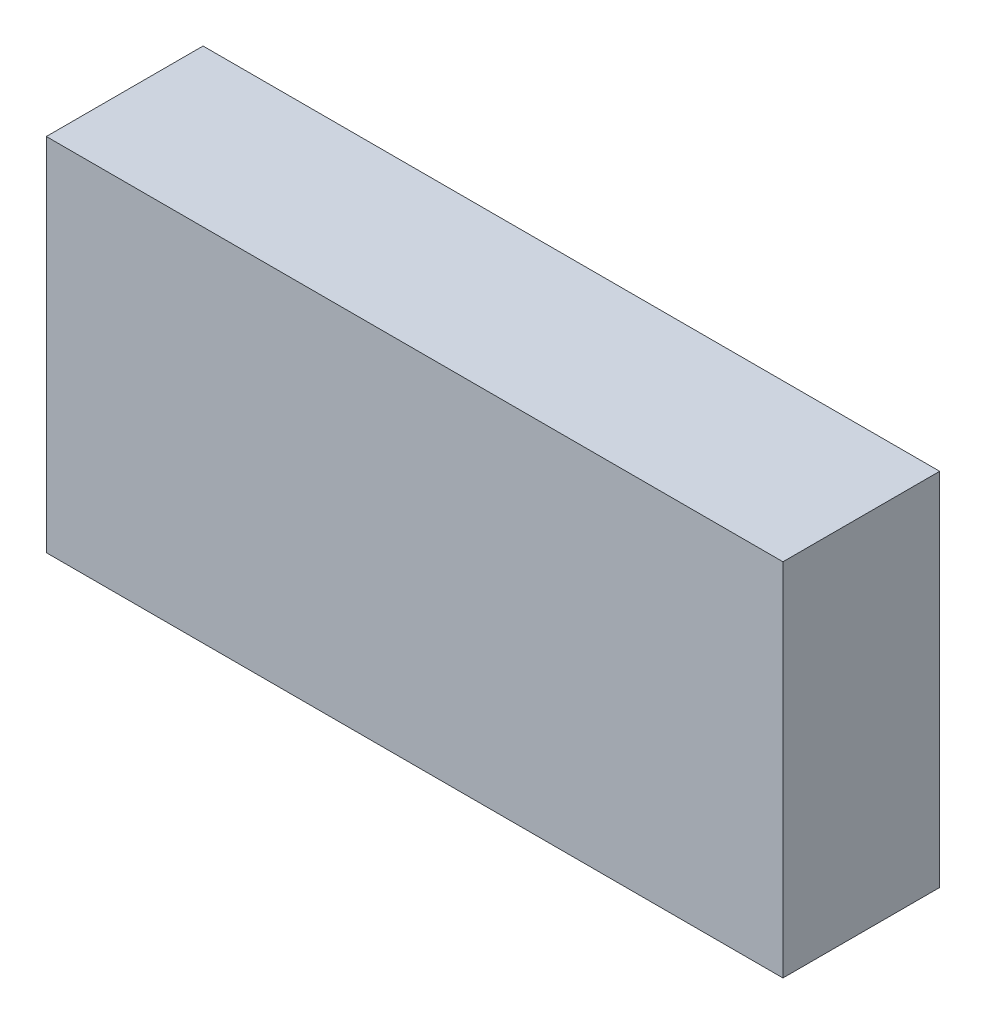
ISO-10303-21;
HEADER;
FILE_DESCRIPTION(('STEP AP214'),'2;1');
FILE_NAME('part.step','',(''),(''),'','','');
FILE_SCHEMA(('AUTOMOTIVE_DESIGN { 1 0 10303 214 1 1 1 1 }'));
ENDSEC;
DATA;
#1=APPLICATION_CONTEXT('core data for automotive mechanical design processes');
#2=APPLICATION_PROTOCOL_DEFINITION('international standard','automotive_design',2000,#1);
#3=PRODUCT_CONTEXT('',#1,'mechanical');
#4=PRODUCT('Part','Part','',(#3));
#5=PRODUCT_RELATED_PRODUCT_CATEGORY('part','',(#4));
#6=PRODUCT_DEFINITION_FORMATION('','',#4);
#7=PRODUCT_DEFINITION_CONTEXT('part definition',#1,'design');
#8=PRODUCT_DEFINITION('design','',#6,#7);
#9=PRODUCT_DEFINITION_SHAPE('','',#8);
#10=(LENGTH_UNIT() NAMED_UNIT(*) SI_UNIT(.MILLI.,.METRE.));
#11=(NAMED_UNIT(*) PLANE_ANGLE_UNIT() SI_UNIT($,.RADIAN.));
#12=(NAMED_UNIT(*) SI_UNIT($,.STERADIAN.) SOLID_ANGLE_UNIT());
#13=UNCERTAINTY_MEASURE_WITH_UNIT(LENGTH_MEASURE(1.E-05),#10,'distance_accuracy_value','');
#14=(GEOMETRIC_REPRESENTATION_CONTEXT(3) GLOBAL_UNCERTAINTY_ASSIGNED_CONTEXT((#13)) GLOBAL_UNIT_ASSIGNED_CONTEXT((#10,
#11,#12)) REPRESENTATION_CONTEXT('',''));
#15=CARTESIAN_POINT('',(0.,0.,0.));
#16=DIRECTION('',(0.,0.,1.));
#17=DIRECTION('',(1.,0.,0.));
#18=AXIS2_PLACEMENT_3D('',#15,#16,#17);
#19=CARTESIAN_POINT('',(-2.35,1.15,1.));
#20=DIRECTION('',(0.,0.,1.));
#21=DIRECTION('',(1.,0.,0.));
#22=AXIS2_PLACEMENT_3D('',#19,#20,#21);
#23=PLANE('',#22);
#24=DIRECTION('',(0.,1.,0.));
#25=VECTOR('',#24,1.);
#26=CARTESIAN_POINT('',(2.35,1.15,1.));
#27=LINE('',#26,#25);
#28=CARTESIAN_POINT('',(2.35,1.15,1.));
#29=VERTEX_POINT('',#28);
#30=CARTESIAN_POINT('',(2.35,-1.15,1.));
#31=VERTEX_POINT('',#30);
#32=EDGE_CURVE('E53',#29,#31,#27,.F.);
#33=ORIENTED_EDGE('',*,*,#32,.F.);
#34=DIRECTION('',(1.,0.,0.));
#35=VECTOR('',#34,1.);
#36=CARTESIAN_POINT('',(-2.35,1.15,1.));
#37=LINE('',#36,#35);
#38=CARTESIAN_POINT('',(-2.35,1.15,1.));
#39=VERTEX_POINT('',#38);
#40=EDGE_CURVE('E68',#39,#29,#37,.T.);
#41=ORIENTED_EDGE('',*,*,#40,.F.);
#42=DIRECTION('',(0.,1.,0.));
#43=VECTOR('',#42,1.);
#44=CARTESIAN_POINT('',(-2.35,-1.15,1.));
#45=LINE('',#44,#43);
#46=CARTESIAN_POINT('',(-2.35,-1.15,1.));
#47=VERTEX_POINT('',#46);
#48=EDGE_CURVE('E20',#47,#39,#45,.T.);
#49=ORIENTED_EDGE('',*,*,#48,.F.);
#50=DIRECTION('',(1.,0.,0.));
#51=VECTOR('',#50,1.);
#52=CARTESIAN_POINT('',(2.35,-1.15,1.));
#53=LINE('',#52,#51);
#54=EDGE_CURVE('E58',#31,#47,#53,.F.);
#55=ORIENTED_EDGE('',*,*,#54,.F.);
#56=EDGE_LOOP('',(#33,#41,#49,#55));
#57=FACE_BOUND('',#56,.T.);
#58=ADVANCED_FACE('F17',(#57),#23,.T.);
#59=CARTESIAN_POINT('',(-2.35,-1.15,0.));
#60=DIRECTION('',(-1.,0.,0.));
#61=DIRECTION('',(0.,0.,1.));
#62=AXIS2_PLACEMENT_3D('',#59,#60,#61);
#63=PLANE('',#62);
#64=DIRECTION('',(0.,0.,1.));
#65=VECTOR('',#64,1.);
#66=CARTESIAN_POINT('',(-2.35,1.15,0.));
#67=LINE('',#66,#65);
#68=CARTESIAN_POINT('',(-2.35,1.15,0.));
#69=VERTEX_POINT('',#68);
#70=EDGE_CURVE('E79',#69,#39,#67,.T.);
#71=ORIENTED_EDGE('',*,*,#70,.F.);
#72=DIRECTION('',(0.,1.,0.));
#73=VECTOR('',#72,1.);
#74=CARTESIAN_POINT('',(-2.35,1.15,0.));
#75=LINE('',#74,#73);
#76=CARTESIAN_POINT('',(-2.35,-1.15,0.));
#77=VERTEX_POINT('',#76);
#78=EDGE_CURVE('E74',#69,#77,#75,.F.);
#79=ORIENTED_EDGE('',*,*,#78,.T.);
#80=DIRECTION('',(0.,0.,-1.));
#81=VECTOR('',#80,1.);
#82=CARTESIAN_POINT('',(-2.35,-1.15,0.));
#83=LINE('',#82,#81);
#84=EDGE_CURVE('E63',#47,#77,#83,.T.);
#85=ORIENTED_EDGE('',*,*,#84,.F.);
#86=ORIENTED_EDGE('',*,*,#48,.T.);
#87=EDGE_LOOP('',(#71,#79,#85,#86));
#88=FACE_BOUND('',#87,.T.);
#89=ADVANCED_FACE('F73',(#88),#63,.T.);
#90=CARTESIAN_POINT('',(2.35,-1.15,0.));
#91=DIRECTION('',(0.,-1.,0.));
#92=DIRECTION('',(0.,0.,-1.));
#93=AXIS2_PLACEMENT_3D('',#90,#91,#92);
#94=PLANE('',#93);
#95=ORIENTED_EDGE('',*,*,#84,.T.);
#96=DIRECTION('',(1.,0.,0.));
#97=VECTOR('',#96,1.);
#98=CARTESIAN_POINT('',(-2.35,-1.15,0.));
#99=LINE('',#98,#97);
#100=CARTESIAN_POINT('',(2.35,-1.15,0.));
#101=VERTEX_POINT('',#100);
#102=EDGE_CURVE('E84',#77,#101,#99,.T.);
#103=ORIENTED_EDGE('',*,*,#102,.T.);
#104=DIRECTION('',(0.,0.,-1.));
#105=VECTOR('',#104,1.);
#106=CARTESIAN_POINT('',(2.35,-1.15,0.));
#107=LINE('',#106,#105);
#108=EDGE_CURVE('E65',#31,#101,#107,.T.);
#109=ORIENTED_EDGE('',*,*,#108,.F.);
#110=ORIENTED_EDGE('',*,*,#54,.T.);
#111=EDGE_LOOP('',(#95,#103,#109,#110));
#112=FACE_BOUND('',#111,.T.);
#113=ADVANCED_FACE('F60',(#112),#94,.T.);
#114=CARTESIAN_POINT('',(2.35,1.15,0.));
#115=DIRECTION('',(1.,0.,0.));
#116=DIRECTION('',(0.,0.,-1.));
#117=AXIS2_PLACEMENT_3D('',#114,#115,#116);
#118=PLANE('',#117);
#119=ORIENTED_EDGE('',*,*,#108,.T.);
#120=DIRECTION('',(0.,1.,0.));
#121=VECTOR('',#120,1.);
#122=CARTESIAN_POINT('',(2.35,1.15,0.));
#123=LINE('',#122,#121);
#124=CARTESIAN_POINT('',(2.35,1.15,0.));
#125=VERTEX_POINT('',#124);
#126=EDGE_CURVE('E26',#101,#125,#123,.T.);
#127=ORIENTED_EDGE('',*,*,#126,.T.);
#128=DIRECTION('',(0.,0.,1.));
#129=VECTOR('',#128,1.);
#130=CARTESIAN_POINT('',(2.35,1.15,0.));
#131=LINE('',#130,#129);
#132=EDGE_CURVE('E34',#29,#125,#131,.F.);
#133=ORIENTED_EDGE('',*,*,#132,.F.);
#134=ORIENTED_EDGE('',*,*,#32,.T.);
#135=EDGE_LOOP('',(#119,#127,#133,#134));
#136=FACE_BOUND('',#135,.T.);
#137=ADVANCED_FACE('F88',(#136),#118,.T.);
#138=CARTESIAN_POINT('',(-2.35,1.15,0.));
#139=DIRECTION('',(0.,1.,0.));
#140=DIRECTION('',(0.,0.,1.));
#141=AXIS2_PLACEMENT_3D('',#138,#139,#140);
#142=PLANE('',#141);
#143=ORIENTED_EDGE('',*,*,#132,.T.);
#144=DIRECTION('',(1.,0.,0.));
#145=VECTOR('',#144,1.);
#146=CARTESIAN_POINT('',(-2.35,1.15,0.));
#147=LINE('',#146,#145);
#148=EDGE_CURVE('E11',#125,#69,#147,.F.);
#149=ORIENTED_EDGE('',*,*,#148,.T.);
#150=ORIENTED_EDGE('',*,*,#70,.T.);
#151=ORIENTED_EDGE('',*,*,#40,.T.);
#152=EDGE_LOOP('',(#143,#149,#150,#151));
#153=FACE_BOUND('',#152,.T.);
#154=ADVANCED_FACE('F91',(#153),#142,.T.);
#155=CARTESIAN_POINT('',(-2.35,1.15,0.));
#156=DIRECTION('',(0.,0.,1.));
#157=DIRECTION('',(1.,0.,0.));
#158=AXIS2_PLACEMENT_3D('',#155,#156,#157);
#159=PLANE('',#158);
#160=ORIENTED_EDGE('',*,*,#126,.F.);
#161=ORIENTED_EDGE('',*,*,#102,.F.);
#162=ORIENTED_EDGE('',*,*,#78,.F.);
#163=ORIENTED_EDGE('',*,*,#148,.F.);
#164=EDGE_LOOP('',(#160,#161,#162,#163));
#165=FACE_BOUND('',#164,.T.);
#166=ADVANCED_FACE('F90',(#165),#159,.F.);
#167=CLOSED_SHELL('',(#58,#89,#113,#137,#154,#166));
#168=MANIFOLD_SOLID_BREP('B1',#167);
#169=ADVANCED_BREP_SHAPE_REPRESENTATION('',(#18,#168),#14);
#170=SHAPE_DEFINITION_REPRESENTATION(#9,#169);
ENDSEC;
END-ISO-10303-21;
